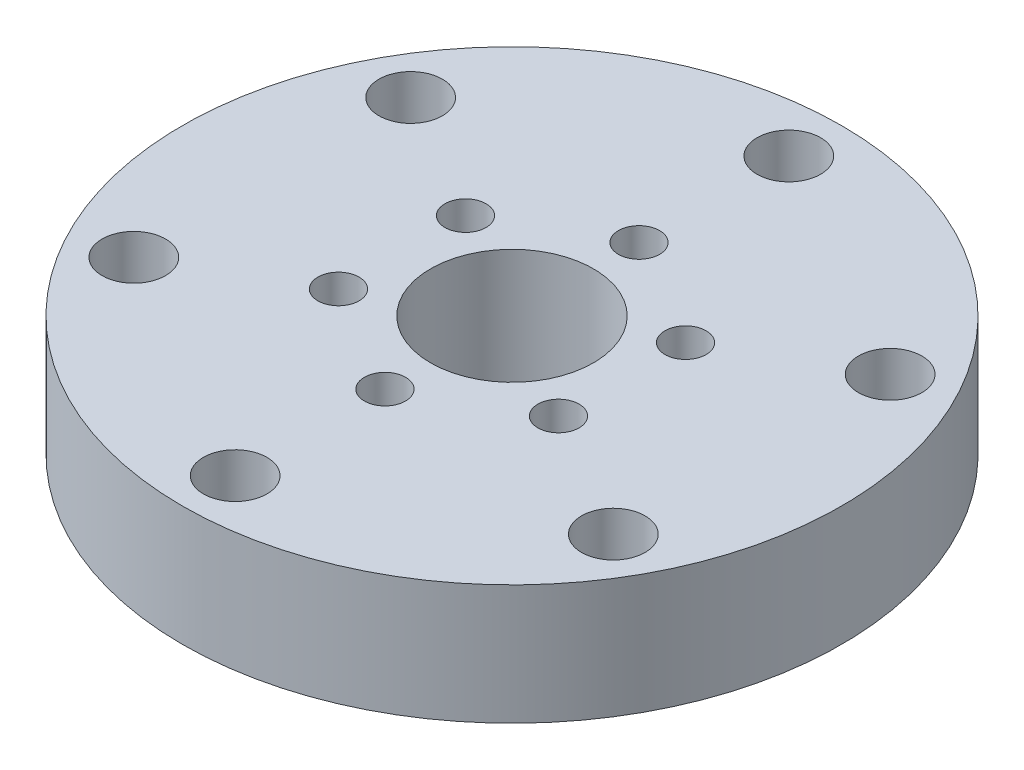
ISO-10303-21;
HEADER;
FILE_DESCRIPTION(('STEP AP214'),'2;1');
FILE_NAME('part.step','',(''),(''),'','','');
FILE_SCHEMA(('AUTOMOTIVE_DESIGN { 1 0 10303 214 1 1 1 1 }'));
ENDSEC;
DATA;
#1=APPLICATION_CONTEXT('core data for automotive mechanical design processes');
#2=APPLICATION_PROTOCOL_DEFINITION('international standard','automotive_design',2000,#1);
#3=PRODUCT_CONTEXT('',#1,'mechanical');
#4=PRODUCT('Part','Part','',(#3));
#5=PRODUCT_RELATED_PRODUCT_CATEGORY('part','',(#4));
#6=PRODUCT_DEFINITION_FORMATION('','',#4);
#7=PRODUCT_DEFINITION_CONTEXT('part definition',#1,'design');
#8=PRODUCT_DEFINITION('design','',#6,#7);
#9=PRODUCT_DEFINITION_SHAPE('','',#8);
#10=(LENGTH_UNIT() NAMED_UNIT(*) SI_UNIT(.MILLI.,.METRE.));
#11=(NAMED_UNIT(*) PLANE_ANGLE_UNIT() SI_UNIT($,.RADIAN.));
#12=(NAMED_UNIT(*) SI_UNIT($,.STERADIAN.) SOLID_ANGLE_UNIT());
#13=UNCERTAINTY_MEASURE_WITH_UNIT(LENGTH_MEASURE(1.E-05),#10,'distance_accuracy_value','');
#14=(GEOMETRIC_REPRESENTATION_CONTEXT(3) GLOBAL_UNCERTAINTY_ASSIGNED_CONTEXT((#13)) GLOBAL_UNIT_ASSIGNED_CONTEXT((#10,
#11,#12)) REPRESENTATION_CONTEXT('',''));
#15=CARTESIAN_POINT('',(0.,0.,0.));
#16=DIRECTION('',(0.,0.,1.));
#17=DIRECTION('',(1.,0.,0.));
#18=AXIS2_PLACEMENT_3D('',#15,#16,#17);
#19=CARTESIAN_POINT('',(0.,12.7,0.));
#20=DIRECTION('',(0.,1.,0.));
#21=DIRECTION('',(0.,0.,1.));
#22=AXIS2_PLACEMENT_3D('',#19,#20,#21);
#23=PLANE('',#22);
#24=CARTESIAN_POINT('',(11.6584339857462,12.7,6.73099999999989));
#25=DIRECTION('',(0.,1.,0.));
#26=DIRECTION('',(-0.866025403784443,0.,-0.499999999999992));
#27=AXIS2_PLACEMENT_3D('',#24,#25,#26);
#28=CIRCLE('',#27,2.1844);
#29=CARTESIAN_POINT('',(9.76668809371944,12.7,5.63879999999991));
#30=VERTEX_POINT('',#29);
#31=EDGE_CURVE('E104',#30,#30,#28,.T.);
#32=ORIENTED_EDGE('',*,*,#31,.F.);
#33=EDGE_LOOP('',(#32));
#34=FACE_BOUND('',#33,.T.);
#35=CARTESIAN_POINT('',(-11.6584339857461,12.7,6.73100000000006));
#36=DIRECTION('',(0.,1.,0.));
#37=DIRECTION('',(0.866025403784436,0.,-0.500000000000004));
#38=AXIS2_PLACEMENT_3D('',#35,#36,#37);
#39=CIRCLE('',#38,2.1844);
#40=CARTESIAN_POINT('',(-9.76668809371936,12.7,5.63880000000005));
#41=VERTEX_POINT('',#40);
#42=EDGE_CURVE('E92',#41,#41,#39,.T.);
#43=ORIENTED_EDGE('',*,*,#42,.F.);
#44=EDGE_LOOP('',(#43));
#45=FACE_BOUND('',#44,.T.);
#46=CARTESIAN_POINT('',(0.,12.7,-13.462));
#47=DIRECTION('',(0.,1.,0.));
#48=DIRECTION('',(0.,0.,1.));
#49=AXIS2_PLACEMENT_3D('',#46,#47,#48);
#50=CIRCLE('',#49,2.1844);
#51=CARTESIAN_POINT('',(0.,12.7,-11.2776));
#52=VERTEX_POINT('',#51);
#53=EDGE_CURVE('E80',#52,#52,#50,.T.);
#54=ORIENTED_EDGE('',*,*,#53,.F.);
#55=EDGE_LOOP('',(#54));
#56=FACE_BOUND('',#55,.T.);
#57=CARTESIAN_POINT('',(25.4065872708242,12.7,14.6684999999998));
#58=DIRECTION('',(0.,1.,0.));
#59=DIRECTION('',(-0.866025403784443,0.,-0.499999999999992));
#60=AXIS2_PLACEMENT_3D('',#57,#58,#59);
#61=CIRCLE('',#60,3.3655);
#62=CARTESIAN_POINT('',(22.4919787743877,12.7,12.9857499999998));
#63=VERTEX_POINT('',#62);
#64=EDGE_CURVE('E68',#63,#63,#61,.T.);
#65=ORIENTED_EDGE('',*,*,#64,.F.);
#66=EDGE_LOOP('',(#65));
#67=FACE_BOUND('',#66,.T.);
#68=CARTESIAN_POINT('',(-25.406587270824,12.7,14.6685000000001));
#69=DIRECTION('',(0.,1.,0.));
#70=DIRECTION('',(0.866025403784436,0.,-0.500000000000004));
#71=AXIS2_PLACEMENT_3D('',#68,#69,#70);
#72=CIRCLE('',#71,3.3655);
#73=CARTESIAN_POINT('',(-22.4919787743875,12.7,12.9857500000001));
#74=VERTEX_POINT('',#73);
#75=EDGE_CURVE('E56',#74,#74,#72,.T.);
#76=ORIENTED_EDGE('',*,*,#75,.F.);
#77=EDGE_LOOP('',(#76));
#78=FACE_BOUND('',#77,.T.);
#79=CARTESIAN_POINT('',(0.,12.7,-29.337));
#80=DIRECTION('',(0.,1.,0.));
#81=DIRECTION('',(0.,0.,1.));
#82=AXIS2_PLACEMENT_3D('',#79,#80,#81);
#83=CIRCLE('',#82,3.3655);
#84=CARTESIAN_POINT('',(0.,12.7,-25.9715));
#85=VERTEX_POINT('',#84);
#86=EDGE_CURVE('E44',#85,#85,#83,.T.);
#87=ORIENTED_EDGE('',*,*,#86,.F.);
#88=EDGE_LOOP('',(#87));
#89=FACE_BOUND('',#88,.T.);
#90=CARTESIAN_POINT('',(0.,12.7,0.));
#91=DIRECTION('',(0.,1.,0.));
#92=DIRECTION('',(0.,0.,1.));
#93=AXIS2_PLACEMENT_3D('',#90,#91,#92);
#94=CIRCLE('',#93,34.925);
#95=CARTESIAN_POINT('',(0.,12.7,34.925));
#96=VERTEX_POINT('',#95);
#97=EDGE_CURVE('E10',#96,#96,#94,.T.);
#98=ORIENTED_EDGE('',*,*,#97,.T.);
#99=EDGE_LOOP('',(#98));
#100=FACE_BOUND('',#99,.T.);
#101=CARTESIAN_POINT('',(0.,12.7,0.));
#102=DIRECTION('',(0.,1.,0.));
#103=DIRECTION('',(0.,0.,1.));
#104=AXIS2_PLACEMENT_3D('',#101,#102,#103);
#105=CIRCLE('',#104,8.636);
#106=CARTESIAN_POINT('',(0.,12.7,8.636));
#107=VERTEX_POINT('',#106);
#108=EDGE_CURVE('E39',#107,#107,#105,.T.);
#109=ORIENTED_EDGE('',*,*,#108,.F.);
#110=EDGE_LOOP('',(#109));
#111=FACE_BOUND('',#110,.T.);
#112=CARTESIAN_POINT('',(-25.4065872708241,12.7,-14.6684999999999));
#113=DIRECTION('',(0.,1.,0.));
#114=DIRECTION('',(0.86602540378444,0.,0.499999999999998));
#115=AXIS2_PLACEMENT_3D('',#112,#113,#114);
#116=CIRCLE('',#115,3.3655);
#117=CARTESIAN_POINT('',(-22.4919787743876,12.7,-12.9857499999999));
#118=VERTEX_POINT('',#117);
#119=EDGE_CURVE('E50',#118,#118,#116,.T.);
#120=ORIENTED_EDGE('',*,*,#119,.F.);
#121=EDGE_LOOP('',(#120));
#122=FACE_BOUND('',#121,.T.);
#123=CARTESIAN_POINT('',(2.04859176075282E-13,12.7,29.337));
#124=DIRECTION('',(0.,1.,0.));
#125=DIRECTION('',(0.,0.,-1.));
#126=AXIS2_PLACEMENT_3D('',#123,#124,#125);
#127=CIRCLE('',#126,3.3655);
#128=CARTESIAN_POINT('',(1.81358015183529E-13,12.7,25.9715));
#129=VERTEX_POINT('',#128);
#130=EDGE_CURVE('E62',#129,#129,#127,.T.);
#131=ORIENTED_EDGE('',*,*,#130,.F.);
#132=EDGE_LOOP('',(#131));
#133=FACE_BOUND('',#132,.T.);
#134=CARTESIAN_POINT('',(25.4065872708239,12.7,-14.6685000000003));
#135=DIRECTION('',(0.,1.,0.));
#136=DIRECTION('',(-0.866025403784433,0.,0.50000000000001));
#137=AXIS2_PLACEMENT_3D('',#134,#135,#136);
#138=CIRCLE('',#137,3.3655);
#139=CARTESIAN_POINT('',(22.4919787743874,12.7,-12.9857500000003));
#140=VERTEX_POINT('',#139);
#141=EDGE_CURVE('E74',#140,#140,#138,.T.);
#142=ORIENTED_EDGE('',*,*,#141,.F.);
#143=EDGE_LOOP('',(#142));
#144=FACE_BOUND('',#143,.T.);
#145=CARTESIAN_POINT('',(-11.6584339857461,12.7,-6.73099999999997));
#146=DIRECTION('',(0.,1.,0.));
#147=DIRECTION('',(0.86602540378444,0.,0.499999999999998));
#148=AXIS2_PLACEMENT_3D('',#145,#146,#147);
#149=CIRCLE('',#148,2.1844);
#150=CARTESIAN_POINT('',(-9.7666880937194,12.7,-5.63879999999998));
#151=VERTEX_POINT('',#150);
#152=EDGE_CURVE('E86',#151,#151,#149,.T.);
#153=ORIENTED_EDGE('',*,*,#152,.F.);
#154=EDGE_LOOP('',(#153));
#155=FACE_BOUND('',#154,.T.);
#156=CARTESIAN_POINT('',(0.,12.7,13.462));
#157=DIRECTION('',(0.,1.,0.));
#158=DIRECTION('',(0.,0.,-1.));
#159=AXIS2_PLACEMENT_3D('',#156,#157,#158);
#160=CIRCLE('',#159,2.1844);
#161=CARTESIAN_POINT('',(0.,12.7,11.2776));
#162=VERTEX_POINT('',#161);
#163=EDGE_CURVE('E98',#162,#162,#160,.T.);
#164=ORIENTED_EDGE('',*,*,#163,.F.);
#165=EDGE_LOOP('',(#164));
#166=FACE_BOUND('',#165,.T.);
#167=CARTESIAN_POINT('',(11.658433985746,12.7,-6.73100000000014));
#168=DIRECTION('',(0.,1.,0.));
#169=DIRECTION('',(-0.866025403784433,0.,0.50000000000001));
#170=AXIS2_PLACEMENT_3D('',#167,#168,#169);
#171=CIRCLE('',#170,2.1844);
#172=CARTESIAN_POINT('',(9.76668809371932,12.7,-5.63880000000011));
#173=VERTEX_POINT('',#172);
#174=EDGE_CURVE('E110',#173,#173,#171,.T.);
#175=ORIENTED_EDGE('',*,*,#174,.F.);
#176=EDGE_LOOP('',(#175));
#177=FACE_BOUND('',#176,.T.);
#178=ADVANCED_FACE('F28',(#34,#45,#56,#67,#78,#89,#100,#111,#122,#133,#144,#155,#166,#177),#23,.T.);
#179=CARTESIAN_POINT('',(0.,0.,0.));
#180=DIRECTION('',(0.,1.,0.));
#181=DIRECTION('',(0.,0.,1.));
#182=AXIS2_PLACEMENT_3D('',#179,#180,#181);
#183=PLANE('',#182);
#184=CARTESIAN_POINT('',(11.6584339857462,0.,6.73099999999989));
#185=DIRECTION('',(0.,1.,0.));
#186=DIRECTION('',(-0.866025403784443,0.,-0.499999999999992));
#187=AXIS2_PLACEMENT_3D('',#184,#185,#186);
#188=CIRCLE('',#187,2.1844);
#189=CARTESIAN_POINT('',(9.76668809371944,0.,5.63879999999991));
#190=VERTEX_POINT('',#189);
#191=EDGE_CURVE('E107',#190,#190,#188,.T.);
#192=ORIENTED_EDGE('',*,*,#191,.T.);
#193=EDGE_LOOP('',(#192));
#194=FACE_BOUND('',#193,.T.);
#195=CARTESIAN_POINT('',(-11.6584339857461,0.,6.73100000000006));
#196=DIRECTION('',(0.,1.,0.));
#197=DIRECTION('',(0.866025403784436,0.,-0.500000000000004));
#198=AXIS2_PLACEMENT_3D('',#195,#196,#197);
#199=CIRCLE('',#198,2.1844);
#200=CARTESIAN_POINT('',(-9.76668809371936,0.,5.63880000000005));
#201=VERTEX_POINT('',#200);
#202=EDGE_CURVE('E95',#201,#201,#199,.T.);
#203=ORIENTED_EDGE('',*,*,#202,.T.);
#204=EDGE_LOOP('',(#203));
#205=FACE_BOUND('',#204,.T.);
#206=CARTESIAN_POINT('',(0.,0.,-13.462));
#207=DIRECTION('',(0.,1.,0.));
#208=DIRECTION('',(0.,0.,1.));
#209=AXIS2_PLACEMENT_3D('',#206,#207,#208);
#210=CIRCLE('',#209,2.1844);
#211=CARTESIAN_POINT('',(0.,0.,-11.2776));
#212=VERTEX_POINT('',#211);
#213=EDGE_CURVE('E83',#212,#212,#210,.T.);
#214=ORIENTED_EDGE('',*,*,#213,.T.);
#215=EDGE_LOOP('',(#214));
#216=FACE_BOUND('',#215,.T.);
#217=CARTESIAN_POINT('',(25.4065872708242,0.,14.6684999999998));
#218=DIRECTION('',(0.,1.,0.));
#219=DIRECTION('',(-0.866025403784443,0.,-0.499999999999992));
#220=AXIS2_PLACEMENT_3D('',#217,#218,#219);
#221=CIRCLE('',#220,3.3655);
#222=CARTESIAN_POINT('',(22.4919787743877,0.,12.9857499999998));
#223=VERTEX_POINT('',#222);
#224=EDGE_CURVE('E71',#223,#223,#221,.T.);
#225=ORIENTED_EDGE('',*,*,#224,.T.);
#226=EDGE_LOOP('',(#225));
#227=FACE_BOUND('',#226,.T.);
#228=CARTESIAN_POINT('',(-25.406587270824,0.,14.6685000000001));
#229=DIRECTION('',(0.,1.,0.));
#230=DIRECTION('',(0.866025403784436,0.,-0.500000000000004));
#231=AXIS2_PLACEMENT_3D('',#228,#229,#230);
#232=CIRCLE('',#231,3.3655);
#233=CARTESIAN_POINT('',(-22.4919787743875,0.,12.9857500000001));
#234=VERTEX_POINT('',#233);
#235=EDGE_CURVE('E59',#234,#234,#232,.T.);
#236=ORIENTED_EDGE('',*,*,#235,.T.);
#237=EDGE_LOOP('',(#236));
#238=FACE_BOUND('',#237,.T.);
#239=CARTESIAN_POINT('',(0.,0.,-29.337));
#240=DIRECTION('',(0.,1.,0.));
#241=DIRECTION('',(0.,0.,1.));
#242=AXIS2_PLACEMENT_3D('',#239,#240,#241);
#243=CIRCLE('',#242,3.3655);
#244=CARTESIAN_POINT('',(0.,0.,-25.9715));
#245=VERTEX_POINT('',#244);
#246=EDGE_CURVE('E47',#245,#245,#243,.T.);
#247=ORIENTED_EDGE('',*,*,#246,.T.);
#248=EDGE_LOOP('',(#247));
#249=FACE_BOUND('',#248,.T.);
#250=CARTESIAN_POINT('',(0.,0.,0.));
#251=DIRECTION('',(0.,1.,0.));
#252=DIRECTION('',(0.,0.,1.));
#253=AXIS2_PLACEMENT_3D('',#250,#251,#252);
#254=CIRCLE('',#253,34.925);
#255=CARTESIAN_POINT('',(0.,0.,34.925));
#256=VERTEX_POINT('',#255);
#257=EDGE_CURVE('E32',#256,#256,#254,.T.);
#258=ORIENTED_EDGE('',*,*,#257,.F.);
#259=EDGE_LOOP('',(#258));
#260=FACE_BOUND('',#259,.T.);
#261=CARTESIAN_POINT('',(0.,0.,0.));
#262=DIRECTION('',(0.,1.,0.));
#263=DIRECTION('',(0.,0.,1.));
#264=AXIS2_PLACEMENT_3D('',#261,#262,#263);
#265=CIRCLE('',#264,8.636);
#266=CARTESIAN_POINT('',(0.,0.,8.636));
#267=VERTEX_POINT('',#266);
#268=EDGE_CURVE('E41',#267,#267,#265,.T.);
#269=ORIENTED_EDGE('',*,*,#268,.T.);
#270=EDGE_LOOP('',(#269));
#271=FACE_BOUND('',#270,.T.);
#272=CARTESIAN_POINT('',(-25.4065872708241,0.,-14.6684999999999));
#273=DIRECTION('',(0.,1.,0.));
#274=DIRECTION('',(0.86602540378444,0.,0.499999999999998));
#275=AXIS2_PLACEMENT_3D('',#272,#273,#274);
#276=CIRCLE('',#275,3.3655);
#277=CARTESIAN_POINT('',(-22.4919787743876,0.,-12.9857499999999));
#278=VERTEX_POINT('',#277);
#279=EDGE_CURVE('E53',#278,#278,#276,.T.);
#280=ORIENTED_EDGE('',*,*,#279,.T.);
#281=EDGE_LOOP('',(#280));
#282=FACE_BOUND('',#281,.T.);
#283=CARTESIAN_POINT('',(2.04859176075282E-13,0.,29.337));
#284=DIRECTION('',(0.,1.,0.));
#285=DIRECTION('',(0.,0.,-1.));
#286=AXIS2_PLACEMENT_3D('',#283,#284,#285);
#287=CIRCLE('',#286,3.3655);
#288=CARTESIAN_POINT('',(1.81358015183529E-13,0.,25.9715));
#289=VERTEX_POINT('',#288);
#290=EDGE_CURVE('E65',#289,#289,#287,.T.);
#291=ORIENTED_EDGE('',*,*,#290,.T.);
#292=EDGE_LOOP('',(#291));
#293=FACE_BOUND('',#292,.T.);
#294=CARTESIAN_POINT('',(25.4065872708239,0.,-14.6685000000003));
#295=DIRECTION('',(0.,1.,0.));
#296=DIRECTION('',(-0.866025403784433,0.,0.50000000000001));
#297=AXIS2_PLACEMENT_3D('',#294,#295,#296);
#298=CIRCLE('',#297,3.3655);
#299=CARTESIAN_POINT('',(22.4919787743874,0.,-12.9857500000003));
#300=VERTEX_POINT('',#299);
#301=EDGE_CURVE('E77',#300,#300,#298,.T.);
#302=ORIENTED_EDGE('',*,*,#301,.T.);
#303=EDGE_LOOP('',(#302));
#304=FACE_BOUND('',#303,.T.);
#305=CARTESIAN_POINT('',(-11.6584339857461,0.,-6.73099999999997));
#306=DIRECTION('',(0.,1.,0.));
#307=DIRECTION('',(0.86602540378444,0.,0.499999999999998));
#308=AXIS2_PLACEMENT_3D('',#305,#306,#307);
#309=CIRCLE('',#308,2.1844);
#310=CARTESIAN_POINT('',(-9.7666880937194,0.,-5.63879999999998));
#311=VERTEX_POINT('',#310);
#312=EDGE_CURVE('E89',#311,#311,#309,.T.);
#313=ORIENTED_EDGE('',*,*,#312,.T.);
#314=EDGE_LOOP('',(#313));
#315=FACE_BOUND('',#314,.T.);
#316=CARTESIAN_POINT('',(0.,0.,13.462));
#317=DIRECTION('',(0.,1.,0.));
#318=DIRECTION('',(0.,0.,-1.));
#319=AXIS2_PLACEMENT_3D('',#316,#317,#318);
#320=CIRCLE('',#319,2.1844);
#321=CARTESIAN_POINT('',(0.,0.,11.2776));
#322=VERTEX_POINT('',#321);
#323=EDGE_CURVE('E101',#322,#322,#320,.T.);
#324=ORIENTED_EDGE('',*,*,#323,.T.);
#325=EDGE_LOOP('',(#324));
#326=FACE_BOUND('',#325,.T.);
#327=CARTESIAN_POINT('',(11.658433985746,0.,-6.73100000000014));
#328=DIRECTION('',(0.,1.,0.));
#329=DIRECTION('',(-0.866025403784433,0.,0.50000000000001));
#330=AXIS2_PLACEMENT_3D('',#327,#328,#329);
#331=CIRCLE('',#330,2.1844);
#332=CARTESIAN_POINT('',(9.76668809371932,0.,-5.63880000000011));
#333=VERTEX_POINT('',#332);
#334=EDGE_CURVE('E113',#333,#333,#331,.T.);
#335=ORIENTED_EDGE('',*,*,#334,.T.);
#336=EDGE_LOOP('',(#335));
#337=FACE_BOUND('',#336,.T.);
#338=ADVANCED_FACE('F123',(#194,#205,#216,#227,#238,#249,#260,#271,#282,#293,#304,#315,#326,
#337),#183,.F.);
#339=CARTESIAN_POINT('',(0.,12.7,0.));
#340=DIRECTION('',(0.,-1.,0.));
#341=DIRECTION('',(0.,0.,-1.));
#342=AXIS2_PLACEMENT_3D('',#339,#340,#341);
#343=CYLINDRICAL_SURFACE('',#342,34.925);
#344=ORIENTED_EDGE('',*,*,#97,.F.);
#345=EDGE_LOOP('',(#344));
#346=FACE_BOUND('',#345,.T.);
#347=ORIENTED_EDGE('',*,*,#257,.T.);
#348=EDGE_LOOP('',(#347));
#349=FACE_BOUND('',#348,.T.);
#350=ADVANCED_FACE('F30',(#346,#349),#343,.T.);
#351=CARTESIAN_POINT('',(0.,12.7,0.));
#352=DIRECTION('',(0.,-1.,0.));
#353=DIRECTION('',(0.,0.,-1.));
#354=AXIS2_PLACEMENT_3D('',#351,#352,#353);
#355=CYLINDRICAL_SURFACE('',#354,8.636);
#356=ORIENTED_EDGE('',*,*,#108,.T.);
#357=EDGE_LOOP('',(#356));
#358=FACE_BOUND('',#357,.T.);
#359=ORIENTED_EDGE('',*,*,#268,.F.);
#360=EDGE_LOOP('',(#359));
#361=FACE_BOUND('',#360,.T.);
#362=ADVANCED_FACE('F133',(#358,#361),#355,.F.);
#363=CARTESIAN_POINT('',(0.,12.7,-29.337));
#364=DIRECTION('',(0.,-1.,0.));
#365=DIRECTION('',(0.,0.,-1.));
#366=AXIS2_PLACEMENT_3D('',#363,#364,#365);
#367=CYLINDRICAL_SURFACE('',#366,3.3655);
#368=ORIENTED_EDGE('',*,*,#86,.T.);
#369=EDGE_LOOP('',(#368));
#370=FACE_BOUND('',#369,.T.);
#371=ORIENTED_EDGE('',*,*,#246,.F.);
#372=EDGE_LOOP('',(#371));
#373=FACE_BOUND('',#372,.T.);
#374=ADVANCED_FACE('F136',(#370,#373),#367,.F.);
#375=CARTESIAN_POINT('',(-25.4065872708241,12.7,-14.6684999999999));
#376=DIRECTION('',(0.,-1.,0.));
#377=DIRECTION('',(0.,0.,-1.));
#378=AXIS2_PLACEMENT_3D('',#375,#376,#377);
#379=CYLINDRICAL_SURFACE('',#378,3.3655);
#380=ORIENTED_EDGE('',*,*,#119,.T.);
#381=EDGE_LOOP('',(#380));
#382=FACE_BOUND('',#381,.T.);
#383=ORIENTED_EDGE('',*,*,#279,.F.);
#384=EDGE_LOOP('',(#383));
#385=FACE_BOUND('',#384,.T.);
#386=ADVANCED_FACE('F140',(#382,#385),#379,.F.);
#387=CARTESIAN_POINT('',(-25.406587270824,12.7,14.6685000000001));
#388=DIRECTION('',(0.,-1.,0.));
#389=DIRECTION('',(0.,0.,-1.));
#390=AXIS2_PLACEMENT_3D('',#387,#388,#389);
#391=CYLINDRICAL_SURFACE('',#390,3.3655);
#392=ORIENTED_EDGE('',*,*,#75,.T.);
#393=EDGE_LOOP('',(#392));
#394=FACE_BOUND('',#393,.T.);
#395=ORIENTED_EDGE('',*,*,#235,.F.);
#396=EDGE_LOOP('',(#395));
#397=FACE_BOUND('',#396,.T.);
#398=ADVANCED_FACE('F144',(#394,#397),#391,.F.);
#399=CARTESIAN_POINT('',(2.04859176075282E-13,12.7,29.337));
#400=DIRECTION('',(0.,-1.,0.));
#401=DIRECTION('',(0.,0.,-1.));
#402=AXIS2_PLACEMENT_3D('',#399,#400,#401);
#403=CYLINDRICAL_SURFACE('',#402,3.3655);
#404=ORIENTED_EDGE('',*,*,#130,.T.);
#405=EDGE_LOOP('',(#404));
#406=FACE_BOUND('',#405,.T.);
#407=ORIENTED_EDGE('',*,*,#290,.F.);
#408=EDGE_LOOP('',(#407));
#409=FACE_BOUND('',#408,.T.);
#410=ADVANCED_FACE('F148',(#406,#409),#403,.F.);
#411=CARTESIAN_POINT('',(25.4065872708242,12.7,14.6684999999998));
#412=DIRECTION('',(0.,-1.,0.));
#413=DIRECTION('',(0.,0.,-1.));
#414=AXIS2_PLACEMENT_3D('',#411,#412,#413);
#415=CYLINDRICAL_SURFACE('',#414,3.3655);
#416=ORIENTED_EDGE('',*,*,#64,.T.);
#417=EDGE_LOOP('',(#416));
#418=FACE_BOUND('',#417,.T.);
#419=ORIENTED_EDGE('',*,*,#224,.F.);
#420=EDGE_LOOP('',(#419));
#421=FACE_BOUND('',#420,.T.);
#422=ADVANCED_FACE('F152',(#418,#421),#415,.F.);
#423=CARTESIAN_POINT('',(25.4065872708239,12.7,-14.6685000000003));
#424=DIRECTION('',(0.,-1.,0.));
#425=DIRECTION('',(0.,0.,-1.));
#426=AXIS2_PLACEMENT_3D('',#423,#424,#425);
#427=CYLINDRICAL_SURFACE('',#426,3.3655);
#428=ORIENTED_EDGE('',*,*,#141,.T.);
#429=EDGE_LOOP('',(#428));
#430=FACE_BOUND('',#429,.T.);
#431=ORIENTED_EDGE('',*,*,#301,.F.);
#432=EDGE_LOOP('',(#431));
#433=FACE_BOUND('',#432,.T.);
#434=ADVANCED_FACE('F156',(#430,#433),#427,.F.);
#435=CARTESIAN_POINT('',(0.,12.7,-13.462));
#436=DIRECTION('',(0.,-1.,0.));
#437=DIRECTION('',(0.,0.,-1.));
#438=AXIS2_PLACEMENT_3D('',#435,#436,#437);
#439=CYLINDRICAL_SURFACE('',#438,2.1844);
#440=ORIENTED_EDGE('',*,*,#53,.T.);
#441=EDGE_LOOP('',(#440));
#442=FACE_BOUND('',#441,.T.);
#443=ORIENTED_EDGE('',*,*,#213,.F.);
#444=EDGE_LOOP('',(#443));
#445=FACE_BOUND('',#444,.T.);
#446=ADVANCED_FACE('F160',(#442,#445),#439,.F.);
#447=CARTESIAN_POINT('',(-11.6584339857461,12.7,-6.73099999999997));
#448=DIRECTION('',(0.,-1.,0.));
#449=DIRECTION('',(0.,0.,-1.));
#450=AXIS2_PLACEMENT_3D('',#447,#448,#449);
#451=CYLINDRICAL_SURFACE('',#450,2.1844);
#452=ORIENTED_EDGE('',*,*,#152,.T.);
#453=EDGE_LOOP('',(#452));
#454=FACE_BOUND('',#453,.T.);
#455=ORIENTED_EDGE('',*,*,#312,.F.);
#456=EDGE_LOOP('',(#455));
#457=FACE_BOUND('',#456,.T.);
#458=ADVANCED_FACE('F164',(#454,#457),#451,.F.);
#459=CARTESIAN_POINT('',(-11.6584339857461,12.7,6.73100000000006));
#460=DIRECTION('',(0.,-1.,0.));
#461=DIRECTION('',(0.,0.,-1.));
#462=AXIS2_PLACEMENT_3D('',#459,#460,#461);
#463=CYLINDRICAL_SURFACE('',#462,2.1844);
#464=ORIENTED_EDGE('',*,*,#42,.T.);
#465=EDGE_LOOP('',(#464));
#466=FACE_BOUND('',#465,.T.);
#467=ORIENTED_EDGE('',*,*,#202,.F.);
#468=EDGE_LOOP('',(#467));
#469=FACE_BOUND('',#468,.T.);
#470=ADVANCED_FACE('F168',(#466,#469),#463,.F.);
#471=CARTESIAN_POINT('',(0.,12.7,13.462));
#472=DIRECTION('',(0.,-1.,0.));
#473=DIRECTION('',(0.,0.,-1.));
#474=AXIS2_PLACEMENT_3D('',#471,#472,#473);
#475=CYLINDRICAL_SURFACE('',#474,2.1844);
#476=ORIENTED_EDGE('',*,*,#163,.T.);
#477=EDGE_LOOP('',(#476));
#478=FACE_BOUND('',#477,.T.);
#479=ORIENTED_EDGE('',*,*,#323,.F.);
#480=EDGE_LOOP('',(#479));
#481=FACE_BOUND('',#480,.T.);
#482=ADVANCED_FACE('F172',(#478,#481),#475,.F.);
#483=CARTESIAN_POINT('',(11.6584339857462,12.7,6.73099999999989));
#484=DIRECTION('',(0.,-1.,0.));
#485=DIRECTION('',(0.,0.,-1.));
#486=AXIS2_PLACEMENT_3D('',#483,#484,#485);
#487=CYLINDRICAL_SURFACE('',#486,2.1844);
#488=ORIENTED_EDGE('',*,*,#31,.T.);
#489=EDGE_LOOP('',(#488));
#490=FACE_BOUND('',#489,.T.);
#491=ORIENTED_EDGE('',*,*,#191,.F.);
#492=EDGE_LOOP('',(#491));
#493=FACE_BOUND('',#492,.T.);
#494=ADVANCED_FACE('F176',(#490,#493),#487,.F.);
#495=CARTESIAN_POINT('',(11.658433985746,12.7,-6.73100000000014));
#496=DIRECTION('',(0.,-1.,0.));
#497=DIRECTION('',(0.,0.,-1.));
#498=AXIS2_PLACEMENT_3D('',#495,#496,#497);
#499=CYLINDRICAL_SURFACE('',#498,2.1844);
#500=ORIENTED_EDGE('',*,*,#174,.T.);
#501=EDGE_LOOP('',(#500));
#502=FACE_BOUND('',#501,.T.);
#503=ORIENTED_EDGE('',*,*,#334,.F.);
#504=EDGE_LOOP('',(#503));
#505=FACE_BOUND('',#504,.T.);
#506=ADVANCED_FACE('F119',(#502,#505),#499,.F.);
#507=CLOSED_SHELL('',(#178,#338,#350,#362,#374,#386,#398,#410,#422,#434,#446,#458,#470,#482,
#494,#506));
#508=MANIFOLD_SOLID_BREP('B2',#507);
#509=ADVANCED_BREP_SHAPE_REPRESENTATION('',(#18,#508),#14);
#510=SHAPE_DEFINITION_REPRESENTATION(#9,#509);
ENDSEC;
END-ISO-10303-21;
